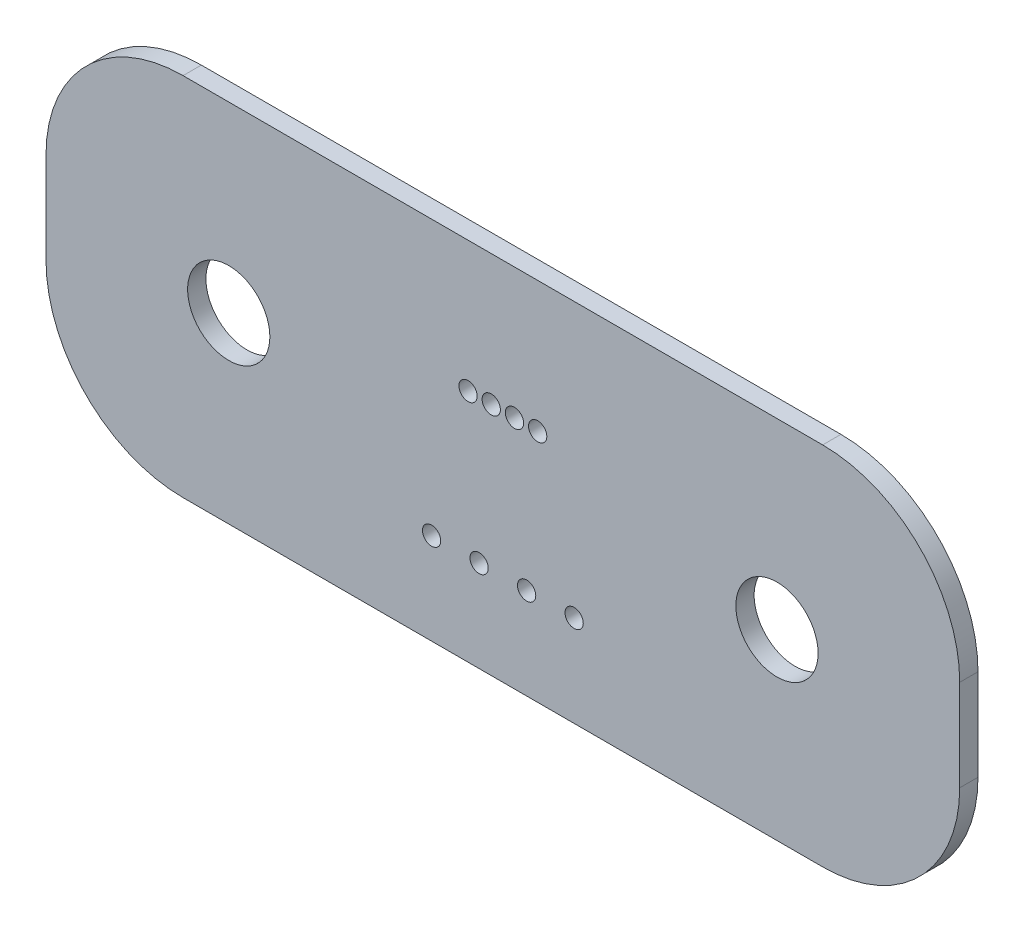
ISO-10303-21;
HEADER;
FILE_DESCRIPTION(('STEP AP214'),'2;1');
FILE_NAME('part.step','',(''),(''),'','','');
FILE_SCHEMA(('AUTOMOTIVE_DESIGN { 1 0 10303 214 1 1 1 1 }'));
ENDSEC;
DATA;
#1=APPLICATION_CONTEXT('core data for automotive mechanical design processes');
#2=APPLICATION_PROTOCOL_DEFINITION('international standard','automotive_design',2000,#1);
#3=PRODUCT_CONTEXT('',#1,'mechanical');
#4=PRODUCT('Part','Part','',(#3));
#5=PRODUCT_RELATED_PRODUCT_CATEGORY('part','',(#4));
#6=PRODUCT_DEFINITION_FORMATION('','',#4);
#7=PRODUCT_DEFINITION_CONTEXT('part definition',#1,'design');
#8=PRODUCT_DEFINITION('design','',#6,#7);
#9=PRODUCT_DEFINITION_SHAPE('','',#8);
#10=(LENGTH_UNIT() NAMED_UNIT(*) SI_UNIT(.MILLI.,.METRE.));
#11=(NAMED_UNIT(*) PLANE_ANGLE_UNIT() SI_UNIT($,.RADIAN.));
#12=(NAMED_UNIT(*) SI_UNIT($,.STERADIAN.) SOLID_ANGLE_UNIT());
#13=UNCERTAINTY_MEASURE_WITH_UNIT(LENGTH_MEASURE(1.E-05),#10,'distance_accuracy_value','');
#14=(GEOMETRIC_REPRESENTATION_CONTEXT(3) GLOBAL_UNCERTAINTY_ASSIGNED_CONTEXT((#13)) GLOBAL_UNIT_ASSIGNED_CONTEXT((#10,
#11,#12)) REPRESENTATION_CONTEXT('',''));
#15=CARTESIAN_POINT('',(0.,0.,0.));
#16=DIRECTION('',(0.,0.,1.));
#17=DIRECTION('',(1.,0.,0.));
#18=AXIS2_PLACEMENT_3D('',#15,#16,#17);
#19=CARTESIAN_POINT('',(0.,-25.,1.));
#20=DIRECTION('',(0.,1.,0.));
#21=DIRECTION('',(0.,0.,1.));
#22=AXIS2_PLACEMENT_3D('',#19,#20,#21);
#23=PLANE('',#22);
#24=DIRECTION('',(1.,0.,0.));
#25=VECTOR('',#24,1.);
#26=CARTESIAN_POINT('',(0.,-25.,0.));
#27=LINE('',#26,#25);
#28=CARTESIAN_POINT('',(-17.5,-25.,0.));
#29=VERTEX_POINT('',#28);
#30=CARTESIAN_POINT('',(17.4999999999999,-25.,0.));
#31=VERTEX_POINT('',#30);
#32=EDGE_CURVE('E188',#29,#31,#27,.T.);
#33=ORIENTED_EDGE('',*,*,#32,.T.);
#34=DIRECTION('',(0.,0.,-1.));
#35=VECTOR('',#34,1.);
#36=CARTESIAN_POINT('',(17.4999999999999,-25.,1.));
#37=LINE('',#36,#35);
#38=CARTESIAN_POINT('',(17.4999999999999,-25.,1.));
#39=VERTEX_POINT('',#38);
#40=EDGE_CURVE('E11',#39,#31,#37,.T.);
#41=ORIENTED_EDGE('',*,*,#40,.F.);
#42=DIRECTION('',(1.,0.,0.));
#43=VECTOR('',#42,1.);
#44=CARTESIAN_POINT('',(0.,-25.,1.));
#45=LINE('',#44,#43);
#46=CARTESIAN_POINT('',(-17.5,-25.,1.));
#47=VERTEX_POINT('',#46);
#48=EDGE_CURVE('E251',#47,#39,#45,.T.);
#49=ORIENTED_EDGE('',*,*,#48,.F.);
#50=DIRECTION('',(0.,0.,-1.));
#51=VECTOR('',#50,1.);
#52=CARTESIAN_POINT('',(-17.5,-25.,1.));
#53=LINE('',#52,#51);
#54=EDGE_CURVE('E63',#47,#29,#53,.T.);
#55=ORIENTED_EDGE('',*,*,#54,.T.);
#56=EDGE_LOOP('',(#33,#41,#49,#55));
#57=FACE_BOUND('',#56,.T.);
#58=ADVANCED_FACE('F45',(#57),#23,.F.);
#59=CARTESIAN_POINT('',(17.5,-17.5,1.));
#60=DIRECTION('',(0.,0.,-1.));
#61=DIRECTION('',(-1.,0.,0.));
#62=AXIS2_PLACEMENT_3D('',#59,#60,#61);
#63=CYLINDRICAL_SURFACE('',#62,7.5);
#64=CARTESIAN_POINT('',(17.5,-17.5,0.));
#65=DIRECTION('',(0.,0.,1.));
#66=DIRECTION('',(1.,0.,0.));
#67=AXIS2_PLACEMENT_3D('',#64,#65,#66);
#68=CIRCLE('',#67,7.5);
#69=CARTESIAN_POINT('',(25.,-17.5,0.));
#70=VERTEX_POINT('',#69);
#71=EDGE_CURVE('E191',#31,#70,#68,.T.);
#72=ORIENTED_EDGE('',*,*,#71,.T.);
#73=DIRECTION('',(0.,0.,-1.));
#74=VECTOR('',#73,1.);
#75=CARTESIAN_POINT('',(25.,-17.5,1.));
#76=LINE('',#75,#74);
#77=CARTESIAN_POINT('',(25.,-17.5,1.));
#78=VERTEX_POINT('',#77);
#79=EDGE_CURVE('E55',#78,#70,#76,.T.);
#80=ORIENTED_EDGE('',*,*,#79,.F.);
#81=CARTESIAN_POINT('',(17.5,-17.5,1.));
#82=DIRECTION('',(0.,0.,1.));
#83=DIRECTION('',(1.,0.,0.));
#84=AXIS2_PLACEMENT_3D('',#81,#82,#83);
#85=CIRCLE('',#84,7.5);
#86=EDGE_CURVE('E101',#39,#78,#85,.T.);
#87=ORIENTED_EDGE('',*,*,#86,.F.);
#88=ORIENTED_EDGE('',*,*,#40,.T.);
#89=EDGE_LOOP('',(#72,#80,#87,#88));
#90=FACE_BOUND('',#89,.T.);
#91=ADVANCED_FACE('F333',(#90),#63,.T.);
#92=CARTESIAN_POINT('',(25.,0.,1.));
#93=DIRECTION('',(-1.,0.,0.));
#94=DIRECTION('',(0.,0.,1.));
#95=AXIS2_PLACEMENT_3D('',#92,#93,#94);
#96=PLANE('',#95);
#97=DIRECTION('',(0.,1.,0.));
#98=VECTOR('',#97,1.);
#99=CARTESIAN_POINT('',(25.,0.,0.));
#100=LINE('',#99,#98);
#101=CARTESIAN_POINT('',(25.,-12.5000000000001,0.));
#102=VERTEX_POINT('',#101);
#103=EDGE_CURVE('E194',#70,#102,#100,.T.);
#104=ORIENTED_EDGE('',*,*,#103,.T.);
#105=DIRECTION('',(0.,0.,-1.));
#106=VECTOR('',#105,1.);
#107=CARTESIAN_POINT('',(25.,-12.5000000000001,1.));
#108=LINE('',#107,#106);
#109=CARTESIAN_POINT('',(25.,-12.5000000000001,1.));
#110=VERTEX_POINT('',#109);
#111=EDGE_CURVE('E225',#110,#102,#108,.T.);
#112=ORIENTED_EDGE('',*,*,#111,.F.);
#113=DIRECTION('',(0.,1.,0.));
#114=VECTOR('',#113,1.);
#115=CARTESIAN_POINT('',(25.,0.,1.));
#116=LINE('',#115,#114);
#117=EDGE_CURVE('E234',#78,#110,#116,.T.);
#118=ORIENTED_EDGE('',*,*,#117,.F.);
#119=ORIENTED_EDGE('',*,*,#79,.T.);
#120=EDGE_LOOP('',(#104,#112,#118,#119));
#121=FACE_BOUND('',#120,.T.);
#122=ADVANCED_FACE('F232',(#121),#96,.F.);
#123=CARTESIAN_POINT('',(17.5,-12.5,1.));
#124=DIRECTION('',(0.,0.,-1.));
#125=DIRECTION('',(-1.,0.,0.));
#126=AXIS2_PLACEMENT_3D('',#123,#124,#125);
#127=CYLINDRICAL_SURFACE('',#126,7.5);
#128=CARTESIAN_POINT('',(17.5,-12.5,0.));
#129=DIRECTION('',(0.,0.,1.));
#130=DIRECTION('',(1.,0.,0.));
#131=AXIS2_PLACEMENT_3D('',#128,#129,#130);
#132=CIRCLE('',#131,7.5);
#133=CARTESIAN_POINT('',(17.4999999999999,-5.,0.));
#134=VERTEX_POINT('',#133);
#135=EDGE_CURVE('E198',#134,#102,#132,.F.);
#136=ORIENTED_EDGE('',*,*,#135,.F.);
#137=DIRECTION('',(0.,0.,-1.));
#138=VECTOR('',#137,1.);
#139=CARTESIAN_POINT('',(17.4999999999999,-5.,1.));
#140=LINE('',#139,#138);
#141=CARTESIAN_POINT('',(17.4999999999999,-5.,1.));
#142=VERTEX_POINT('',#141);
#143=EDGE_CURVE('E222',#142,#134,#140,.T.);
#144=ORIENTED_EDGE('',*,*,#143,.F.);
#145=CARTESIAN_POINT('',(17.5,-12.5,1.));
#146=DIRECTION('',(0.,0.,1.));
#147=DIRECTION('',(1.,0.,0.));
#148=AXIS2_PLACEMENT_3D('',#145,#146,#147);
#149=CIRCLE('',#148,7.5);
#150=EDGE_CURVE('E242',#142,#110,#149,.F.);
#151=ORIENTED_EDGE('',*,*,#150,.T.);
#152=ORIENTED_EDGE('',*,*,#111,.T.);
#153=EDGE_LOOP('',(#136,#144,#151,#152));
#154=FACE_BOUND('',#153,.T.);
#155=ADVANCED_FACE('F240',(#154),#127,.T.);
#156=CARTESIAN_POINT('',(0.,-5.,1.));
#157=DIRECTION('',(0.,1.,0.));
#158=DIRECTION('',(0.,0.,1.));
#159=AXIS2_PLACEMENT_3D('',#156,#157,#158);
#160=PLANE('',#159);
#161=DIRECTION('',(1.,0.,0.));
#162=VECTOR('',#161,1.);
#163=CARTESIAN_POINT('',(0.,-5.,0.));
#164=LINE('',#163,#162);
#165=CARTESIAN_POINT('',(-17.5,-5.,0.));
#166=VERTEX_POINT('',#165);
#167=EDGE_CURVE('E202',#166,#134,#164,.T.);
#168=ORIENTED_EDGE('',*,*,#167,.F.);
#169=DIRECTION('',(0.,0.,-1.));
#170=VECTOR('',#169,1.);
#171=CARTESIAN_POINT('',(-17.5,-5.,1.));
#172=LINE('',#171,#170);
#173=CARTESIAN_POINT('',(-17.5,-5.,1.));
#174=VERTEX_POINT('',#173);
#175=EDGE_CURVE('E138',#174,#166,#172,.T.);
#176=ORIENTED_EDGE('',*,*,#175,.F.);
#177=DIRECTION('',(1.,0.,0.));
#178=VECTOR('',#177,1.);
#179=CARTESIAN_POINT('',(0.,-5.,1.));
#180=LINE('',#179,#178);
#181=EDGE_CURVE('E126',#174,#142,#180,.T.);
#182=ORIENTED_EDGE('',*,*,#181,.T.);
#183=ORIENTED_EDGE('',*,*,#143,.T.);
#184=EDGE_LOOP('',(#168,#176,#182,#183));
#185=FACE_BOUND('',#184,.T.);
#186=ADVANCED_FACE('F406',(#185),#160,.T.);
#187=CARTESIAN_POINT('',(-17.5,-12.5,1.));
#188=DIRECTION('',(0.,0.,-1.));
#189=DIRECTION('',(-1.,0.,0.));
#190=AXIS2_PLACEMENT_3D('',#187,#188,#189);
#191=CYLINDRICAL_SURFACE('',#190,7.5);
#192=CARTESIAN_POINT('',(-17.5,-12.5,0.));
#193=DIRECTION('',(0.,0.,1.));
#194=DIRECTION('',(1.,0.,0.));
#195=AXIS2_PLACEMENT_3D('',#192,#193,#194);
#196=CIRCLE('',#195,7.5);
#197=CARTESIAN_POINT('',(-25.,-12.5,0.));
#198=VERTEX_POINT('',#197);
#199=EDGE_CURVE('E134',#166,#198,#196,.T.);
#200=ORIENTED_EDGE('',*,*,#199,.T.);
#201=DIRECTION('',(0.,0.,-1.));
#202=VECTOR('',#201,1.);
#203=CARTESIAN_POINT('',(-25.,-12.5,1.));
#204=LINE('',#203,#202);
#205=CARTESIAN_POINT('',(-25.,-12.5,1.));
#206=VERTEX_POINT('',#205);
#207=EDGE_CURVE('E131',#206,#198,#204,.T.);
#208=ORIENTED_EDGE('',*,*,#207,.F.);
#209=CARTESIAN_POINT('',(-17.5,-12.5,1.));
#210=DIRECTION('',(0.,0.,1.));
#211=DIRECTION('',(1.,0.,0.));
#212=AXIS2_PLACEMENT_3D('',#209,#210,#211);
#213=CIRCLE('',#212,7.5);
#214=EDGE_CURVE('E118',#174,#206,#213,.T.);
#215=ORIENTED_EDGE('',*,*,#214,.F.);
#216=ORIENTED_EDGE('',*,*,#175,.T.);
#217=EDGE_LOOP('',(#200,#208,#215,#216));
#218=FACE_BOUND('',#217,.T.);
#219=ADVANCED_FACE('F132',(#218),#191,.T.);
#220=CARTESIAN_POINT('',(-25.,0.,1.));
#221=DIRECTION('',(-1.,0.,0.));
#222=DIRECTION('',(0.,0.,1.));
#223=AXIS2_PLACEMENT_3D('',#220,#221,#222);
#224=PLANE('',#223);
#225=DIRECTION('',(0.,1.,0.));
#226=VECTOR('',#225,1.);
#227=CARTESIAN_POINT('',(-25.,0.,0.));
#228=LINE('',#227,#226);
#229=CARTESIAN_POINT('',(-25.,-17.5,0.));
#230=VERTEX_POINT('',#229);
#231=EDGE_CURVE('E208',#230,#198,#228,.T.);
#232=ORIENTED_EDGE('',*,*,#231,.F.);
#233=DIRECTION('',(0.,0.,-1.));
#234=VECTOR('',#233,1.);
#235=CARTESIAN_POINT('',(-25.,-17.5,1.));
#236=LINE('',#235,#234);
#237=CARTESIAN_POINT('',(-25.,-17.5,1.));
#238=VERTEX_POINT('',#237);
#239=EDGE_CURVE('E89',#238,#230,#236,.T.);
#240=ORIENTED_EDGE('',*,*,#239,.F.);
#241=DIRECTION('',(0.,1.,0.));
#242=VECTOR('',#241,1.);
#243=CARTESIAN_POINT('',(-25.,0.,1.));
#244=LINE('',#243,#242);
#245=EDGE_CURVE('E123',#238,#206,#244,.T.);
#246=ORIENTED_EDGE('',*,*,#245,.T.);
#247=ORIENTED_EDGE('',*,*,#207,.T.);
#248=EDGE_LOOP('',(#232,#240,#246,#247));
#249=FACE_BOUND('',#248,.T.);
#250=ADVANCED_FACE('F140',(#249),#224,.T.);
#251=CARTESIAN_POINT('',(0.635000000000001,-12.15,1.));
#252=DIRECTION('',(0.,0.,-1.));
#253=DIRECTION('',(-1.,0.,0.));
#254=AXIS2_PLACEMENT_3D('',#251,#252,#253);
#255=CYLINDRICAL_SURFACE('',#254,0.5);
#256=CARTESIAN_POINT('',(0.635000000000001,-12.15,1.));
#257=DIRECTION('',(0.,0.,1.));
#258=DIRECTION('',(1.,0.,0.));
#259=AXIS2_PLACEMENT_3D('',#256,#257,#258);
#260=CIRCLE('',#259,0.5);
#261=CARTESIAN_POINT('',(1.135,-12.15,1.));
#262=VERTEX_POINT('',#261);
#263=EDGE_CURVE('E254',#262,#262,#260,.T.);
#264=ORIENTED_EDGE('',*,*,#263,.T.);
#265=EDGE_LOOP('',(#264));
#266=FACE_BOUND('',#265,.T.);
#267=CARTESIAN_POINT('',(0.635000000000001,-12.15,0.));
#268=DIRECTION('',(0.,0.,1.));
#269=DIRECTION('',(1.,0.,0.));
#270=AXIS2_PLACEMENT_3D('',#267,#268,#269);
#271=CIRCLE('',#270,0.5);
#272=CARTESIAN_POINT('',(1.135,-12.15,0.));
#273=VERTEX_POINT('',#272);
#274=EDGE_CURVE('E184',#273,#273,#271,.T.);
#275=ORIENTED_EDGE('',*,*,#274,.F.);
#276=EDGE_LOOP('',(#275));
#277=FACE_BOUND('',#276,.T.);
#278=ADVANCED_FACE('F318',(#266,#277),#255,.F.);
#279=CARTESIAN_POINT('',(-0.634999999999998,-12.15,1.));
#280=DIRECTION('',(0.,0.,-1.));
#281=DIRECTION('',(-1.,0.,0.));
#282=AXIS2_PLACEMENT_3D('',#279,#280,#281);
#283=CYLINDRICAL_SURFACE('',#282,0.5);
#284=CARTESIAN_POINT('',(-0.634999999999998,-12.15,1.));
#285=DIRECTION('',(0.,0.,1.));
#286=DIRECTION('',(1.,0.,0.));
#287=AXIS2_PLACEMENT_3D('',#284,#285,#286);
#288=CIRCLE('',#287,0.5);
#289=CARTESIAN_POINT('',(-0.134999999999998,-12.15,1.));
#290=VERTEX_POINT('',#289);
#291=EDGE_CURVE('E258',#290,#290,#288,.T.);
#292=ORIENTED_EDGE('',*,*,#291,.T.);
#293=EDGE_LOOP('',(#292));
#294=FACE_BOUND('',#293,.T.);
#295=CARTESIAN_POINT('',(-0.634999999999998,-12.15,0.));
#296=DIRECTION('',(0.,0.,1.));
#297=DIRECTION('',(1.,0.,0.));
#298=AXIS2_PLACEMENT_3D('',#295,#296,#297);
#299=CIRCLE('',#298,0.5);
#300=CARTESIAN_POINT('',(-0.134999999999998,-12.15,0.));
#301=VERTEX_POINT('',#300);
#302=EDGE_CURVE('E180',#301,#301,#299,.T.);
#303=ORIENTED_EDGE('',*,*,#302,.F.);
#304=EDGE_LOOP('',(#303));
#305=FACE_BOUND('',#304,.T.);
#306=ADVANCED_FACE('F321',(#294,#305),#283,.F.);
#307=CARTESIAN_POINT('',(1.905,-12.15,1.));
#308=DIRECTION('',(0.,0.,-1.));
#309=DIRECTION('',(-1.,0.,0.));
#310=AXIS2_PLACEMENT_3D('',#307,#308,#309);
#311=CYLINDRICAL_SURFACE('',#310,0.5);
#312=CARTESIAN_POINT('',(1.905,-12.15,1.));
#313=DIRECTION('',(0.,0.,1.));
#314=DIRECTION('',(1.,0.,0.));
#315=AXIS2_PLACEMENT_3D('',#312,#313,#314);
#316=CIRCLE('',#315,0.5);
#317=CARTESIAN_POINT('',(2.405,-12.15,1.));
#318=VERTEX_POINT('',#317);
#319=EDGE_CURVE('E262',#318,#318,#316,.T.);
#320=ORIENTED_EDGE('',*,*,#319,.T.);
#321=EDGE_LOOP('',(#320));
#322=FACE_BOUND('',#321,.T.);
#323=CARTESIAN_POINT('',(1.905,-12.15,0.));
#324=DIRECTION('',(0.,0.,1.));
#325=DIRECTION('',(1.,0.,0.));
#326=AXIS2_PLACEMENT_3D('',#323,#324,#325);
#327=CIRCLE('',#326,0.5);
#328=CARTESIAN_POINT('',(2.405,-12.15,0.));
#329=VERTEX_POINT('',#328);
#330=EDGE_CURVE('E176',#329,#329,#327,.T.);
#331=ORIENTED_EDGE('',*,*,#330,.F.);
#332=EDGE_LOOP('',(#331));
#333=FACE_BOUND('',#332,.T.);
#334=ADVANCED_FACE('F343',(#322,#333),#311,.F.);
#335=CARTESIAN_POINT('',(-1.905,-12.15,1.));
#336=DIRECTION('',(0.,0.,-1.));
#337=DIRECTION('',(-1.,0.,0.));
#338=AXIS2_PLACEMENT_3D('',#335,#336,#337);
#339=CYLINDRICAL_SURFACE('',#338,0.5);
#340=CARTESIAN_POINT('',(-1.905,-12.15,1.));
#341=DIRECTION('',(0.,0.,1.));
#342=DIRECTION('',(1.,0.,0.));
#343=AXIS2_PLACEMENT_3D('',#340,#341,#342);
#344=CIRCLE('',#343,0.5);
#345=CARTESIAN_POINT('',(-1.405,-12.15,1.));
#346=VERTEX_POINT('',#345);
#347=EDGE_CURVE('E266',#346,#346,#344,.T.);
#348=ORIENTED_EDGE('',*,*,#347,.T.);
#349=EDGE_LOOP('',(#348));
#350=FACE_BOUND('',#349,.T.);
#351=CARTESIAN_POINT('',(-1.905,-12.15,0.));
#352=DIRECTION('',(0.,0.,1.));
#353=DIRECTION('',(1.,0.,0.));
#354=AXIS2_PLACEMENT_3D('',#351,#352,#353);
#355=CIRCLE('',#354,0.5);
#356=CARTESIAN_POINT('',(-1.405,-12.15,0.));
#357=VERTEX_POINT('',#356);
#358=EDGE_CURVE('E172',#357,#357,#355,.T.);
#359=ORIENTED_EDGE('',*,*,#358,.F.);
#360=EDGE_LOOP('',(#359));
#361=FACE_BOUND('',#360,.T.);
#362=ADVANCED_FACE('F347',(#350,#361),#339,.F.);
#363=CARTESIAN_POINT('',(-15.,-15.,1.));
#364=DIRECTION('',(0.,0.,-1.));
#365=DIRECTION('',(-1.,0.,0.));
#366=AXIS2_PLACEMENT_3D('',#363,#364,#365);
#367=CYLINDRICAL_SURFACE('',#366,2.25);
#368=CARTESIAN_POINT('',(-15.,-15.,1.));
#369=DIRECTION('',(0.,0.,1.));
#370=DIRECTION('',(1.,0.,0.));
#371=AXIS2_PLACEMENT_3D('',#368,#369,#370);
#372=CIRCLE('',#371,2.25);
#373=CARTESIAN_POINT('',(-12.75,-15.,1.));
#374=VERTEX_POINT('',#373);
#375=EDGE_CURVE('E270',#374,#374,#372,.T.);
#376=ORIENTED_EDGE('',*,*,#375,.T.);
#377=EDGE_LOOP('',(#376));
#378=FACE_BOUND('',#377,.T.);
#379=CARTESIAN_POINT('',(-15.,-15.,0.));
#380=DIRECTION('',(0.,0.,1.));
#381=DIRECTION('',(1.,0.,0.));
#382=AXIS2_PLACEMENT_3D('',#379,#380,#381);
#383=CIRCLE('',#382,2.25);
#384=CARTESIAN_POINT('',(-12.75,-15.,0.));
#385=VERTEX_POINT('',#384);
#386=EDGE_CURVE('E168',#385,#385,#383,.T.);
#387=ORIENTED_EDGE('',*,*,#386,.F.);
#388=EDGE_LOOP('',(#387));
#389=FACE_BOUND('',#388,.T.);
#390=ADVANCED_FACE('F351',(#378,#389),#367,.F.);
#391=CARTESIAN_POINT('',(15.,-15.,1.));
#392=DIRECTION('',(0.,0.,-1.));
#393=DIRECTION('',(-1.,0.,0.));
#394=AXIS2_PLACEMENT_3D('',#391,#392,#393);
#395=CYLINDRICAL_SURFACE('',#394,2.25);
#396=CARTESIAN_POINT('',(15.,-15.,1.));
#397=DIRECTION('',(0.,0.,1.));
#398=DIRECTION('',(1.,0.,0.));
#399=AXIS2_PLACEMENT_3D('',#396,#397,#398);
#400=CIRCLE('',#399,2.25);
#401=CARTESIAN_POINT('',(17.25,-15.,1.));
#402=VERTEX_POINT('',#401);
#403=EDGE_CURVE('E274',#402,#402,#400,.T.);
#404=ORIENTED_EDGE('',*,*,#403,.T.);
#405=EDGE_LOOP('',(#404));
#406=FACE_BOUND('',#405,.T.);
#407=CARTESIAN_POINT('',(15.,-15.,0.));
#408=DIRECTION('',(0.,0.,1.));
#409=DIRECTION('',(1.,0.,0.));
#410=AXIS2_PLACEMENT_3D('',#407,#408,#409);
#411=CIRCLE('',#410,2.25);
#412=CARTESIAN_POINT('',(17.25,-15.,0.));
#413=VERTEX_POINT('',#412);
#414=EDGE_CURVE('E164',#413,#413,#411,.T.);
#415=ORIENTED_EDGE('',*,*,#414,.F.);
#416=EDGE_LOOP('',(#415));
#417=FACE_BOUND('',#416,.T.);
#418=ADVANCED_FACE('F355',(#406,#417),#395,.F.);
#419=CARTESIAN_POINT('',(-3.9,-20.,1.));
#420=DIRECTION('',(0.,0.,-1.));
#421=DIRECTION('',(-1.,0.,0.));
#422=AXIS2_PLACEMENT_3D('',#419,#420,#421);
#423=CYLINDRICAL_SURFACE('',#422,0.500000000000001);
#424=CARTESIAN_POINT('',(-3.9,-20.,1.));
#425=DIRECTION('',(0.,0.,1.));
#426=DIRECTION('',(1.,0.,0.));
#427=AXIS2_PLACEMENT_3D('',#424,#425,#426);
#428=CIRCLE('',#427,0.500000000000001);
#429=CARTESIAN_POINT('',(-3.4,-20.,1.));
#430=VERTEX_POINT('',#429);
#431=EDGE_CURVE('E278',#430,#430,#428,.T.);
#432=ORIENTED_EDGE('',*,*,#431,.T.);
#433=EDGE_LOOP('',(#432));
#434=FACE_BOUND('',#433,.T.);
#435=CARTESIAN_POINT('',(-3.9,-20.,0.));
#436=DIRECTION('',(0.,0.,1.));
#437=DIRECTION('',(1.,0.,0.));
#438=AXIS2_PLACEMENT_3D('',#435,#436,#437);
#439=CIRCLE('',#438,0.500000000000001);
#440=CARTESIAN_POINT('',(-3.4,-20.,0.));
#441=VERTEX_POINT('',#440);
#442=EDGE_CURVE('E160',#441,#441,#439,.T.);
#443=ORIENTED_EDGE('',*,*,#442,.F.);
#444=EDGE_LOOP('',(#443));
#445=FACE_BOUND('',#444,.T.);
#446=ADVANCED_FACE('F359',(#434,#445),#423,.F.);
#447=CARTESIAN_POINT('',(-1.3,-20.,1.));
#448=DIRECTION('',(0.,0.,-1.));
#449=DIRECTION('',(-1.,0.,0.));
#450=AXIS2_PLACEMENT_3D('',#447,#448,#449);
#451=CYLINDRICAL_SURFACE('',#450,0.500000000000001);
#452=CARTESIAN_POINT('',(-1.3,-20.,1.));
#453=DIRECTION('',(0.,0.,1.));
#454=DIRECTION('',(1.,0.,0.));
#455=AXIS2_PLACEMENT_3D('',#452,#453,#454);
#456=CIRCLE('',#455,0.500000000000001);
#457=CARTESIAN_POINT('',(-0.799999999999996,-20.,1.));
#458=VERTEX_POINT('',#457);
#459=EDGE_CURVE('E282',#458,#458,#456,.T.);
#460=ORIENTED_EDGE('',*,*,#459,.T.);
#461=EDGE_LOOP('',(#460));
#462=FACE_BOUND('',#461,.T.);
#463=CARTESIAN_POINT('',(-1.3,-20.,0.));
#464=DIRECTION('',(0.,0.,1.));
#465=DIRECTION('',(1.,0.,0.));
#466=AXIS2_PLACEMENT_3D('',#463,#464,#465);
#467=CIRCLE('',#466,0.500000000000001);
#468=CARTESIAN_POINT('',(-0.799999999999996,-20.,0.));
#469=VERTEX_POINT('',#468);
#470=EDGE_CURVE('E156',#469,#469,#467,.T.);
#471=ORIENTED_EDGE('',*,*,#470,.F.);
#472=EDGE_LOOP('',(#471));
#473=FACE_BOUND('',#472,.T.);
#474=ADVANCED_FACE('F363',(#462,#473),#451,.F.);
#475=CARTESIAN_POINT('',(1.3,-20.,1.));
#476=DIRECTION('',(0.,0.,-1.));
#477=DIRECTION('',(-1.,0.,0.));
#478=AXIS2_PLACEMENT_3D('',#475,#476,#477);
#479=CYLINDRICAL_SURFACE('',#478,0.500000000000001);
#480=CARTESIAN_POINT('',(1.3,-20.,1.));
#481=DIRECTION('',(0.,0.,1.));
#482=DIRECTION('',(1.,0.,0.));
#483=AXIS2_PLACEMENT_3D('',#480,#481,#482);
#484=CIRCLE('',#483,0.500000000000001);
#485=CARTESIAN_POINT('',(1.8,-20.,1.));
#486=VERTEX_POINT('',#485);
#487=EDGE_CURVE('E286',#486,#486,#484,.T.);
#488=ORIENTED_EDGE('',*,*,#487,.T.);
#489=EDGE_LOOP('',(#488));
#490=FACE_BOUND('',#489,.T.);
#491=CARTESIAN_POINT('',(1.3,-20.,0.));
#492=DIRECTION('',(0.,0.,1.));
#493=DIRECTION('',(1.,0.,0.));
#494=AXIS2_PLACEMENT_3D('',#491,#492,#493);
#495=CIRCLE('',#494,0.500000000000001);
#496=CARTESIAN_POINT('',(1.8,-20.,0.));
#497=VERTEX_POINT('',#496);
#498=EDGE_CURVE('E152',#497,#497,#495,.T.);
#499=ORIENTED_EDGE('',*,*,#498,.F.);
#500=EDGE_LOOP('',(#499));
#501=FACE_BOUND('',#500,.T.);
#502=ADVANCED_FACE('F366',(#490,#501),#479,.F.);
#503=CARTESIAN_POINT('',(3.9,-20.,1.));
#504=DIRECTION('',(0.,0.,-1.));
#505=DIRECTION('',(-1.,0.,0.));
#506=AXIS2_PLACEMENT_3D('',#503,#504,#505);
#507=CYLINDRICAL_SURFACE('',#506,0.500000000000003);
#508=CARTESIAN_POINT('',(3.9,-20.,1.));
#509=DIRECTION('',(0.,0.,1.));
#510=DIRECTION('',(1.,0.,0.));
#511=AXIS2_PLACEMENT_3D('',#508,#509,#510);
#512=CIRCLE('',#511,0.500000000000003);
#513=CARTESIAN_POINT('',(4.4,-20.,1.));
#514=VERTEX_POINT('',#513);
#515=EDGE_CURVE('E215',#514,#514,#512,.T.);
#516=ORIENTED_EDGE('',*,*,#515,.T.);
#517=EDGE_LOOP('',(#516));
#518=FACE_BOUND('',#517,.T.);
#519=CARTESIAN_POINT('',(3.9,-20.,0.));
#520=DIRECTION('',(0.,0.,1.));
#521=DIRECTION('',(1.,0.,0.));
#522=AXIS2_PLACEMENT_3D('',#519,#520,#521);
#523=CIRCLE('',#522,0.500000000000003);
#524=CARTESIAN_POINT('',(4.4,-20.,0.));
#525=VERTEX_POINT('',#524);
#526=EDGE_CURVE('E148',#525,#525,#523,.T.);
#527=ORIENTED_EDGE('',*,*,#526,.F.);
#528=EDGE_LOOP('',(#527));
#529=FACE_BOUND('',#528,.T.);
#530=ADVANCED_FACE('F47',(#518,#529),#507,.F.);
#531=CARTESIAN_POINT('',(-17.5,-17.5,1.));
#532=DIRECTION('',(0.,0.,-1.));
#533=DIRECTION('',(-1.,0.,0.));
#534=AXIS2_PLACEMENT_3D('',#531,#532,#533);
#535=CYLINDRICAL_SURFACE('',#534,7.5);
#536=CARTESIAN_POINT('',(-17.5,-17.5,0.));
#537=DIRECTION('',(0.,0.,1.));
#538=DIRECTION('',(1.,0.,0.));
#539=AXIS2_PLACEMENT_3D('',#536,#537,#538);
#540=CIRCLE('',#539,7.5);
#541=EDGE_CURVE('E211',#29,#230,#540,.F.);
#542=ORIENTED_EDGE('',*,*,#541,.F.);
#543=ORIENTED_EDGE('',*,*,#54,.F.);
#544=CARTESIAN_POINT('',(-17.5,-17.5,1.));
#545=DIRECTION('',(0.,0.,1.));
#546=DIRECTION('',(1.,0.,0.));
#547=AXIS2_PLACEMENT_3D('',#544,#545,#546);
#548=CIRCLE('',#547,7.5);
#549=EDGE_CURVE('E142',#47,#238,#548,.F.);
#550=ORIENTED_EDGE('',*,*,#549,.T.);
#551=ORIENTED_EDGE('',*,*,#239,.T.);
#552=EDGE_LOOP('',(#542,#543,#550,#551));
#553=FACE_BOUND('',#552,.T.);
#554=ADVANCED_FACE('F298',(#553),#535,.T.);
#555=CARTESIAN_POINT('',(0.,0.,1.));
#556=DIRECTION('',(0.,0.,1.));
#557=DIRECTION('',(1.,0.,0.));
#558=AXIS2_PLACEMENT_3D('',#555,#556,#557);
#559=PLANE('',#558);
#560=ORIENTED_EDGE('',*,*,#515,.F.);
#561=EDGE_LOOP('',(#560));
#562=FACE_BOUND('',#561,.T.);
#563=ORIENTED_EDGE('',*,*,#487,.F.);
#564=EDGE_LOOP('',(#563));
#565=FACE_BOUND('',#564,.T.);
#566=ORIENTED_EDGE('',*,*,#459,.F.);
#567=EDGE_LOOP('',(#566));
#568=FACE_BOUND('',#567,.T.);
#569=ORIENTED_EDGE('',*,*,#431,.F.);
#570=EDGE_LOOP('',(#569));
#571=FACE_BOUND('',#570,.T.);
#572=ORIENTED_EDGE('',*,*,#403,.F.);
#573=EDGE_LOOP('',(#572));
#574=FACE_BOUND('',#573,.T.);
#575=ORIENTED_EDGE('',*,*,#375,.F.);
#576=EDGE_LOOP('',(#575));
#577=FACE_BOUND('',#576,.T.);
#578=ORIENTED_EDGE('',*,*,#347,.F.);
#579=EDGE_LOOP('',(#578));
#580=FACE_BOUND('',#579,.T.);
#581=ORIENTED_EDGE('',*,*,#319,.F.);
#582=EDGE_LOOP('',(#581));
#583=FACE_BOUND('',#582,.T.);
#584=ORIENTED_EDGE('',*,*,#291,.F.);
#585=EDGE_LOOP('',(#584));
#586=FACE_BOUND('',#585,.T.);
#587=ORIENTED_EDGE('',*,*,#263,.F.);
#588=EDGE_LOOP('',(#587));
#589=FACE_BOUND('',#588,.T.);
#590=ORIENTED_EDGE('',*,*,#48,.T.);
#591=ORIENTED_EDGE('',*,*,#86,.T.);
#592=ORIENTED_EDGE('',*,*,#117,.T.);
#593=ORIENTED_EDGE('',*,*,#150,.F.);
#594=ORIENTED_EDGE('',*,*,#181,.F.);
#595=ORIENTED_EDGE('',*,*,#214,.T.);
#596=ORIENTED_EDGE('',*,*,#245,.F.);
#597=ORIENTED_EDGE('',*,*,#549,.F.);
#598=EDGE_LOOP('',(#590,#591,#592,#593,#594,#595,#596,#597));
#599=FACE_BOUND('',#598,.T.);
#600=ADVANCED_FACE('F120',(#562,#565,#568,#571,#574,#577,#580,#583,#586,#589,#599),#559,.T.);
#601=CARTESIAN_POINT('',(0.,0.,0.));
#602=DIRECTION('',(0.,0.,1.));
#603=DIRECTION('',(1.,0.,0.));
#604=AXIS2_PLACEMENT_3D('',#601,#602,#603);
#605=PLANE('',#604);
#606=ORIENTED_EDGE('',*,*,#526,.T.);
#607=EDGE_LOOP('',(#606));
#608=FACE_BOUND('',#607,.T.);
#609=ORIENTED_EDGE('',*,*,#498,.T.);
#610=EDGE_LOOP('',(#609));
#611=FACE_BOUND('',#610,.T.);
#612=ORIENTED_EDGE('',*,*,#470,.T.);
#613=EDGE_LOOP('',(#612));
#614=FACE_BOUND('',#613,.T.);
#615=ORIENTED_EDGE('',*,*,#442,.T.);
#616=EDGE_LOOP('',(#615));
#617=FACE_BOUND('',#616,.T.);
#618=ORIENTED_EDGE('',*,*,#414,.T.);
#619=EDGE_LOOP('',(#618));
#620=FACE_BOUND('',#619,.T.);
#621=ORIENTED_EDGE('',*,*,#386,.T.);
#622=EDGE_LOOP('',(#621));
#623=FACE_BOUND('',#622,.T.);
#624=ORIENTED_EDGE('',*,*,#358,.T.);
#625=EDGE_LOOP('',(#624));
#626=FACE_BOUND('',#625,.T.);
#627=ORIENTED_EDGE('',*,*,#330,.T.);
#628=EDGE_LOOP('',(#627));
#629=FACE_BOUND('',#628,.T.);
#630=ORIENTED_EDGE('',*,*,#302,.T.);
#631=EDGE_LOOP('',(#630));
#632=FACE_BOUND('',#631,.T.);
#633=ORIENTED_EDGE('',*,*,#274,.T.);
#634=EDGE_LOOP('',(#633));
#635=FACE_BOUND('',#634,.T.);
#636=ORIENTED_EDGE('',*,*,#32,.F.);
#637=ORIENTED_EDGE('',*,*,#541,.T.);
#638=ORIENTED_EDGE('',*,*,#231,.T.);
#639=ORIENTED_EDGE('',*,*,#199,.F.);
#640=ORIENTED_EDGE('',*,*,#167,.T.);
#641=ORIENTED_EDGE('',*,*,#135,.T.);
#642=ORIENTED_EDGE('',*,*,#103,.F.);
#643=ORIENTED_EDGE('',*,*,#71,.F.);
#644=EDGE_LOOP('',(#636,#637,#638,#639,#640,#641,#642,#643));
#645=FACE_BOUND('',#644,.T.);
#646=ADVANCED_FACE('F236',(#608,#611,#614,#617,#620,#623,#626,#629,#632,#635,#645),#605,.F.);
#647=CLOSED_SHELL('',(#58,#91,#122,#155,#186,#219,#250,#278,#306,#334,#362,#390,#418,#446,#474,
#502,#530,#554,#600,#646));
#648=MANIFOLD_SOLID_BREP('B2',#647);
#649=ADVANCED_BREP_SHAPE_REPRESENTATION('',(#18,#648),#14);
#650=SHAPE_DEFINITION_REPRESENTATION(#9,#649);
ENDSEC;
END-ISO-10303-21;
